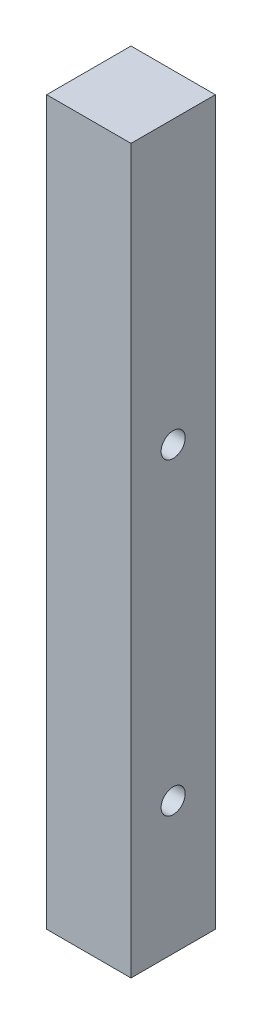
ISO-10303-21;
HEADER;
FILE_DESCRIPTION(('STEP AP214'),'2;1');
FILE_NAME('part.step','',(''),(''),'','','');
FILE_SCHEMA(('AUTOMOTIVE_DESIGN { 1 0 10303 214 1 1 1 1 }'));
ENDSEC;
DATA;
#1=APPLICATION_CONTEXT('core data for automotive mechanical design processes');
#2=APPLICATION_PROTOCOL_DEFINITION('international standard','automotive_design',2000,#1);
#3=PRODUCT_CONTEXT('',#1,'mechanical');
#4=PRODUCT('Part','Part','',(#3));
#5=PRODUCT_RELATED_PRODUCT_CATEGORY('part','',(#4));
#6=PRODUCT_DEFINITION_FORMATION('','',#4);
#7=PRODUCT_DEFINITION_CONTEXT('part definition',#1,'design');
#8=PRODUCT_DEFINITION('design','',#6,#7);
#9=PRODUCT_DEFINITION_SHAPE('','',#8);
#10=(LENGTH_UNIT() NAMED_UNIT(*) SI_UNIT(.MILLI.,.METRE.));
#11=(NAMED_UNIT(*) PLANE_ANGLE_UNIT() SI_UNIT($,.RADIAN.));
#12=(NAMED_UNIT(*) SI_UNIT($,.STERADIAN.) SOLID_ANGLE_UNIT());
#13=UNCERTAINTY_MEASURE_WITH_UNIT(LENGTH_MEASURE(1.E-05),#10,'distance_accuracy_value','');
#14=(GEOMETRIC_REPRESENTATION_CONTEXT(3) GLOBAL_UNCERTAINTY_ASSIGNED_CONTEXT((#13)) GLOBAL_UNIT_ASSIGNED_CONTEXT((#10,
#11,#12)) REPRESENTATION_CONTEXT('',''));
#15=CARTESIAN_POINT('',(0.,0.,0.));
#16=DIRECTION('',(0.,0.,1.));
#17=DIRECTION('',(1.,0.,0.));
#18=AXIS2_PLACEMENT_3D('',#15,#16,#17);
#19=CARTESIAN_POINT('',(0.,600.,0.));
#20=DIRECTION('',(-1.,0.,0.));
#21=DIRECTION('',(0.,0.,1.));
#22=AXIS2_PLACEMENT_3D('',#19,#20,#21);
#23=PLANE('',#22);
#24=CARTESIAN_POINT('',(0.,110.,35.));
#25=DIRECTION('',(1.,0.,0.));
#26=DIRECTION('',(0.,0.,-1.));
#27=AXIS2_PLACEMENT_3D('',#24,#25,#26);
#28=CIRCLE('',#27,10.);
#29=CARTESIAN_POINT('',(0.,110.,25.));
#30=VERTEX_POINT('',#29);
#31=EDGE_CURVE('E112',#30,#30,#28,.T.);
#32=ORIENTED_EDGE('',*,*,#31,.F.);
#33=EDGE_LOOP('',(#32));
#34=FACE_BOUND('',#33,.T.);
#35=CARTESIAN_POINT('',(0.,366.,35.));
#36=DIRECTION('',(1.,0.,0.));
#37=DIRECTION('',(0.,0.,-1.));
#38=AXIS2_PLACEMENT_3D('',#35,#36,#37);
#39=CIRCLE('',#38,10.);
#40=CARTESIAN_POINT('',(0.,366.,25.));
#41=VERTEX_POINT('',#40);
#42=EDGE_CURVE('E117',#41,#41,#39,.T.);
#43=ORIENTED_EDGE('',*,*,#42,.F.);
#44=EDGE_LOOP('',(#43));
#45=FACE_BOUND('',#44,.T.);
#46=DIRECTION('',(0.,0.,-1.));
#47=VECTOR('',#46,1.);
#48=CARTESIAN_POINT('',(0.,0.,0.));
#49=LINE('',#48,#47);
#50=CARTESIAN_POINT('',(0.,0.,70.));
#51=VERTEX_POINT('',#50);
#52=CARTESIAN_POINT('',(0.,0.,0.));
#53=VERTEX_POINT('',#52);
#54=EDGE_CURVE('E103',#51,#53,#49,.T.);
#55=ORIENTED_EDGE('',*,*,#54,.T.);
#56=DIRECTION('',(0.,-1.,0.));
#57=VECTOR('',#56,1.);
#58=CARTESIAN_POINT('',(0.,600.,0.));
#59=LINE('',#58,#57);
#60=CARTESIAN_POINT('',(0.,600.,0.));
#61=VERTEX_POINT('',#60);
#62=EDGE_CURVE('E11',#61,#53,#59,.T.);
#63=ORIENTED_EDGE('',*,*,#62,.F.);
#64=DIRECTION('',(0.,0.,-1.));
#65=VECTOR('',#64,1.);
#66=CARTESIAN_POINT('',(0.,600.,0.));
#67=LINE('',#66,#65);
#68=CARTESIAN_POINT('',(0.,600.,70.));
#69=VERTEX_POINT('',#68);
#70=EDGE_CURVE('E90',#69,#61,#67,.T.);
#71=ORIENTED_EDGE('',*,*,#70,.F.);
#72=DIRECTION('',(0.,-1.,0.));
#73=VECTOR('',#72,1.);
#74=CARTESIAN_POINT('',(0.,600.,70.));
#75=LINE('',#74,#73);
#76=EDGE_CURVE('E99',#69,#51,#75,.T.);
#77=ORIENTED_EDGE('',*,*,#76,.T.);
#78=EDGE_LOOP('',(#55,#63,#71,#77));
#79=FACE_BOUND('',#78,.T.);
#80=ADVANCED_FACE('F37',(#34,#45,#79),#23,.F.);
#81=CARTESIAN_POINT('',(0.,600.,0.));
#82=DIRECTION('',(0.,0.,1.));
#83=DIRECTION('',(1.,0.,0.));
#84=AXIS2_PLACEMENT_3D('',#81,#82,#83);
#85=PLANE('',#84);
#86=DIRECTION('',(-1.,0.,0.));
#87=VECTOR('',#86,1.);
#88=CARTESIAN_POINT('',(0.,0.,0.));
#89=LINE('',#88,#87);
#90=CARTESIAN_POINT('',(-70.,0.,0.));
#91=VERTEX_POINT('',#90);
#92=EDGE_CURVE('E94',#53,#91,#89,.T.);
#93=ORIENTED_EDGE('',*,*,#92,.T.);
#94=DIRECTION('',(0.,-1.,0.));
#95=VECTOR('',#94,1.);
#96=CARTESIAN_POINT('',(-70.,600.,0.));
#97=LINE('',#96,#95);
#98=CARTESIAN_POINT('',(-70.,600.,0.));
#99=VERTEX_POINT('',#98);
#100=EDGE_CURVE('E46',#99,#91,#97,.T.);
#101=ORIENTED_EDGE('',*,*,#100,.F.);
#102=DIRECTION('',(-1.,0.,0.));
#103=VECTOR('',#102,1.);
#104=CARTESIAN_POINT('',(0.,600.,0.));
#105=LINE('',#104,#103);
#106=EDGE_CURVE('E85',#61,#99,#105,.T.);
#107=ORIENTED_EDGE('',*,*,#106,.F.);
#108=ORIENTED_EDGE('',*,*,#62,.T.);
#109=EDGE_LOOP('',(#93,#101,#107,#108));
#110=FACE_BOUND('',#109,.T.);
#111=ADVANCED_FACE('F93',(#110),#85,.F.);
#112=CARTESIAN_POINT('',(-70.,600.,0.));
#113=DIRECTION('',(1.,0.,0.));
#114=DIRECTION('',(0.,0.,-1.));
#115=AXIS2_PLACEMENT_3D('',#112,#113,#114);
#116=PLANE('',#115);
#117=CARTESIAN_POINT('',(-70.,110.,35.));
#118=DIRECTION('',(1.,0.,0.));
#119=DIRECTION('',(0.,0.,-1.));
#120=AXIS2_PLACEMENT_3D('',#117,#118,#119);
#121=CIRCLE('',#120,10.);
#122=CARTESIAN_POINT('',(-70.,110.,25.));
#123=VERTEX_POINT('',#122);
#124=EDGE_CURVE('E40',#123,#123,#121,.T.);
#125=ORIENTED_EDGE('',*,*,#124,.T.);
#126=EDGE_LOOP('',(#125));
#127=FACE_BOUND('',#126,.T.);
#128=CARTESIAN_POINT('',(-70.,366.,35.));
#129=DIRECTION('',(1.,0.,0.));
#130=DIRECTION('',(0.,0.,-1.));
#131=AXIS2_PLACEMENT_3D('',#128,#129,#130);
#132=CIRCLE('',#131,10.);
#133=CARTESIAN_POINT('',(-70.,366.,25.));
#134=VERTEX_POINT('',#133);
#135=EDGE_CURVE('E110',#134,#134,#132,.T.);
#136=ORIENTED_EDGE('',*,*,#135,.T.);
#137=EDGE_LOOP('',(#136));
#138=FACE_BOUND('',#137,.T.);
#139=DIRECTION('',(0.,0.,1.));
#140=VECTOR('',#139,1.);
#141=CARTESIAN_POINT('',(-70.,0.,0.));
#142=LINE('',#141,#140);
#143=CARTESIAN_POINT('',(-70.,0.,70.));
#144=VERTEX_POINT('',#143);
#145=EDGE_CURVE('E72',#91,#144,#142,.T.);
#146=ORIENTED_EDGE('',*,*,#145,.T.);
#147=DIRECTION('',(0.,-1.,0.));
#148=VECTOR('',#147,1.);
#149=CARTESIAN_POINT('',(-70.,600.,70.));
#150=LINE('',#149,#148);
#151=CARTESIAN_POINT('',(-70.,600.,70.));
#152=VERTEX_POINT('',#151);
#153=EDGE_CURVE('E95',#152,#144,#150,.T.);
#154=ORIENTED_EDGE('',*,*,#153,.F.);
#155=DIRECTION('',(0.,0.,1.));
#156=VECTOR('',#155,1.);
#157=CARTESIAN_POINT('',(-70.,600.,0.));
#158=LINE('',#157,#156);
#159=EDGE_CURVE('E88',#99,#152,#158,.T.);
#160=ORIENTED_EDGE('',*,*,#159,.F.);
#161=ORIENTED_EDGE('',*,*,#100,.T.);
#162=EDGE_LOOP('',(#146,#154,#160,#161));
#163=FACE_BOUND('',#162,.T.);
#164=ADVANCED_FACE('F97',(#127,#138,#163),#116,.F.);
#165=CARTESIAN_POINT('',(0.,600.,70.));
#166=DIRECTION('',(0.,0.,-1.));
#167=DIRECTION('',(-1.,0.,0.));
#168=AXIS2_PLACEMENT_3D('',#165,#166,#167);
#169=PLANE('',#168);
#170=DIRECTION('',(1.,0.,0.));
#171=VECTOR('',#170,1.);
#172=CARTESIAN_POINT('',(0.,0.,70.));
#173=LINE('',#172,#171);
#174=EDGE_CURVE('E78',#144,#51,#173,.T.);
#175=ORIENTED_EDGE('',*,*,#174,.T.);
#176=ORIENTED_EDGE('',*,*,#76,.F.);
#177=DIRECTION('',(1.,0.,0.));
#178=VECTOR('',#177,1.);
#179=CARTESIAN_POINT('',(0.,600.,70.));
#180=LINE('',#179,#178);
#181=EDGE_CURVE('E55',#152,#69,#180,.T.);
#182=ORIENTED_EDGE('',*,*,#181,.F.);
#183=ORIENTED_EDGE('',*,*,#153,.T.);
#184=EDGE_LOOP('',(#175,#176,#182,#183));
#185=FACE_BOUND('',#184,.T.);
#186=ADVANCED_FACE('F142',(#185),#169,.F.);
#187=CARTESIAN_POINT('',(0.,600.,0.));
#188=DIRECTION('',(0.,-1.,0.));
#189=DIRECTION('',(0.,0.,-1.));
#190=AXIS2_PLACEMENT_3D('',#187,#188,#189);
#191=PLANE('',#190);
#192=ORIENTED_EDGE('',*,*,#70,.T.);
#193=ORIENTED_EDGE('',*,*,#106,.T.);
#194=ORIENTED_EDGE('',*,*,#159,.T.);
#195=ORIENTED_EDGE('',*,*,#181,.T.);
#196=EDGE_LOOP('',(#192,#193,#194,#195));
#197=FACE_BOUND('',#196,.T.);
#198=ADVANCED_FACE('F86',(#197),#191,.F.);
#199=CARTESIAN_POINT('',(0.,0.,0.));
#200=DIRECTION('',(0.,-1.,0.));
#201=DIRECTION('',(0.,0.,-1.));
#202=AXIS2_PLACEMENT_3D('',#199,#200,#201);
#203=PLANE('',#202);
#204=ORIENTED_EDGE('',*,*,#54,.F.);
#205=ORIENTED_EDGE('',*,*,#174,.F.);
#206=ORIENTED_EDGE('',*,*,#145,.F.);
#207=ORIENTED_EDGE('',*,*,#92,.F.);
#208=EDGE_LOOP('',(#204,#205,#206,#207));
#209=FACE_BOUND('',#208,.T.);
#210=ADVANCED_FACE('F133',(#209),#203,.T.);
#211=CARTESIAN_POINT('',(-119.,366.,35.));
#212=DIRECTION('',(1.,0.,0.));
#213=DIRECTION('',(0.,0.,-1.));
#214=AXIS2_PLACEMENT_3D('',#211,#212,#213);
#215=CYLINDRICAL_SURFACE('',#214,10.);
#216=ORIENTED_EDGE('',*,*,#42,.T.);
#217=EDGE_LOOP('',(#216));
#218=FACE_BOUND('',#217,.T.);
#219=ORIENTED_EDGE('',*,*,#135,.F.);
#220=EDGE_LOOP('',(#219));
#221=FACE_BOUND('',#220,.T.);
#222=ADVANCED_FACE('F125',(#218,#221),#215,.F.);
#223=CARTESIAN_POINT('',(-119.,110.,35.));
#224=DIRECTION('',(1.,0.,0.));
#225=DIRECTION('',(0.,0.,-1.));
#226=AXIS2_PLACEMENT_3D('',#223,#224,#225);
#227=CYLINDRICAL_SURFACE('',#226,10.);
#228=ORIENTED_EDGE('',*,*,#31,.T.);
#229=EDGE_LOOP('',(#228));
#230=FACE_BOUND('',#229,.T.);
#231=ORIENTED_EDGE('',*,*,#124,.F.);
#232=EDGE_LOOP('',(#231));
#233=FACE_BOUND('',#232,.T.);
#234=ADVANCED_FACE('F140',(#230,#233),#227,.F.);
#235=CLOSED_SHELL('',(#80,#111,#164,#186,#198,#210,#222,#234));
#236=MANIFOLD_SOLID_BREP('B2',#235);
#237=ADVANCED_BREP_SHAPE_REPRESENTATION('',(#18,#236),#14);
#238=SHAPE_DEFINITION_REPRESENTATION(#9,#237);
ENDSEC;
END-ISO-10303-21;
